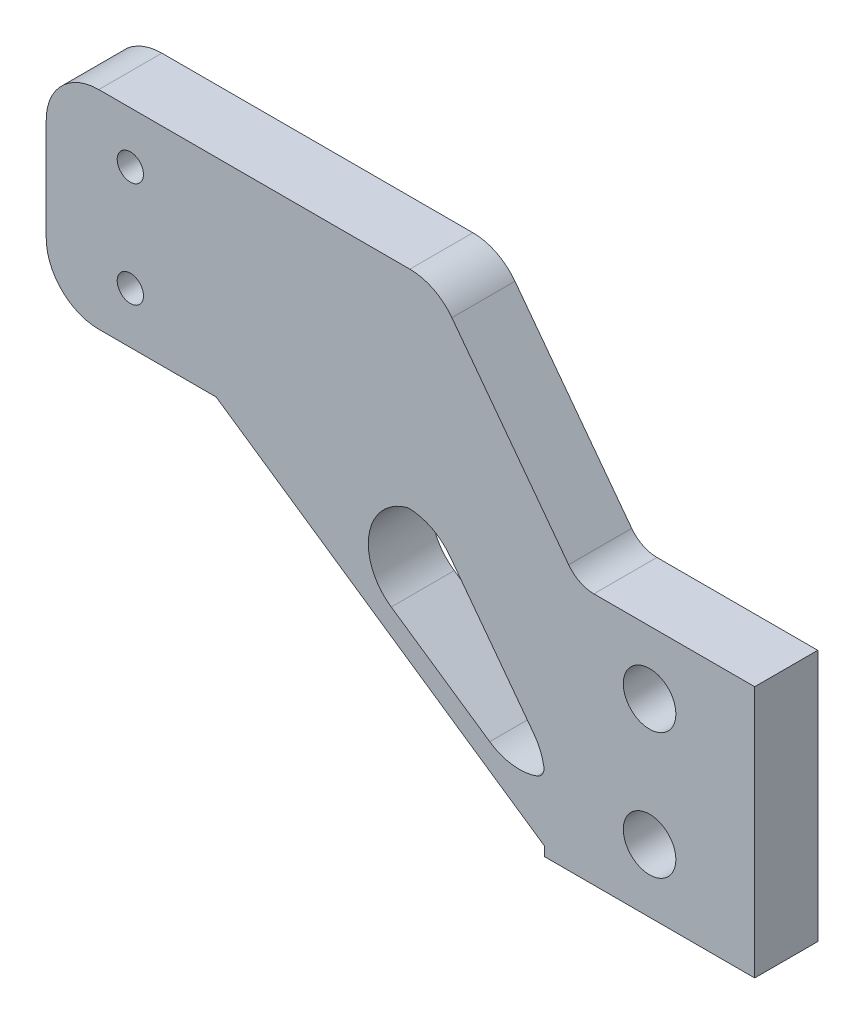
ISO-10303-21;
HEADER;
FILE_DESCRIPTION(('STEP AP214'),'2;1');
FILE_NAME('part.step','',(''),(''),'','','');
FILE_SCHEMA(('AUTOMOTIVE_DESIGN { 1 0 10303 214 1 1 1 1 }'));
ENDSEC;
DATA;
#1=APPLICATION_CONTEXT('core data for automotive mechanical design processes');
#2=APPLICATION_PROTOCOL_DEFINITION('international standard','automotive_design',2000,#1);
#3=PRODUCT_CONTEXT('',#1,'mechanical');
#4=PRODUCT('Part','Part','',(#3));
#5=PRODUCT_RELATED_PRODUCT_CATEGORY('part','',(#4));
#6=PRODUCT_DEFINITION_FORMATION('','',#4);
#7=PRODUCT_DEFINITION_CONTEXT('part definition',#1,'design');
#8=PRODUCT_DEFINITION('design','',#6,#7);
#9=PRODUCT_DEFINITION_SHAPE('','',#8);
#10=(LENGTH_UNIT() NAMED_UNIT(*) SI_UNIT(.MILLI.,.METRE.));
#11=(NAMED_UNIT(*) PLANE_ANGLE_UNIT() SI_UNIT($,.RADIAN.));
#12=(NAMED_UNIT(*) SI_UNIT($,.STERADIAN.) SOLID_ANGLE_UNIT());
#13=UNCERTAINTY_MEASURE_WITH_UNIT(LENGTH_MEASURE(1.E-05),#10,'distance_accuracy_value','');
#14=(GEOMETRIC_REPRESENTATION_CONTEXT(3) GLOBAL_UNCERTAINTY_ASSIGNED_CONTEXT((#13)) GLOBAL_UNIT_ASSIGNED_CONTEXT((#10,
#11,#12)) REPRESENTATION_CONTEXT('',''));
#15=CARTESIAN_POINT('',(0.,0.,0.));
#16=DIRECTION('',(0.,0.,1.));
#17=DIRECTION('',(1.,0.,0.));
#18=AXIS2_PLACEMENT_3D('',#15,#16,#17);
#19=CARTESIAN_POINT('',(-32.0936332487191,-14.75,6.));
#20=DIRECTION('',(0.,0.,-1.));
#21=DIRECTION('',(-1.,0.,0.));
#22=AXIS2_PLACEMENT_3D('',#19,#20,#21);
#23=PLANE('',#22);
#24=CARTESIAN_POINT('',(-29.0936332487191,-14.875,6.));
#25=DIRECTION('',(0.,0.,1.));
#26=DIRECTION('',(1.,0.,0.));
#27=AXIS2_PLACEMENT_3D('',#24,#25,#26);
#28=CIRCLE('',#27,1.25);
#29=CARTESIAN_POINT('',(-27.8436332487191,-14.875,6.));
#30=VERTEX_POINT('',#29);
#31=EDGE_CURVE('E208',#30,#30,#28,.T.);
#32=ORIENTED_EDGE('',*,*,#31,.F.);
#33=EDGE_LOOP('',(#32));
#34=FACE_BOUND('',#33,.T.);
#35=CARTESIAN_POINT('',(-29.0936332487191,-4.875,6.));
#36=DIRECTION('',(0.,0.,1.));
#37=DIRECTION('',(1.,0.,0.));
#38=AXIS2_PLACEMENT_3D('',#35,#36,#37);
#39=CIRCLE('',#38,1.25);
#40=CARTESIAN_POINT('',(-27.8436332487191,-4.875,6.));
#41=VERTEX_POINT('',#40);
#42=EDGE_CURVE('E214',#41,#41,#39,.T.);
#43=ORIENTED_EDGE('',*,*,#42,.F.);
#44=EDGE_LOOP('',(#43));
#45=FACE_BOUND('',#44,.T.);
#46=CARTESIAN_POINT('',(20.3063667512809,-24.,6.));
#47=DIRECTION('',(0.,0.,1.));
#48=DIRECTION('',(1.,0.,0.));
#49=AXIS2_PLACEMENT_3D('',#46,#47,#48);
#50=CIRCLE('',#49,2.5);
#51=CARTESIAN_POINT('',(22.8063667512809,-24.,6.));
#52=VERTEX_POINT('',#51);
#53=EDGE_CURVE('E220',#52,#52,#50,.T.);
#54=ORIENTED_EDGE('',*,*,#53,.F.);
#55=EDGE_LOOP('',(#54));
#56=FACE_BOUND('',#55,.T.);
#57=CARTESIAN_POINT('',(20.3063667512809,-36.,6.));
#58=DIRECTION('',(0.,0.,1.));
#59=DIRECTION('',(1.,0.,0.));
#60=AXIS2_PLACEMENT_3D('',#57,#58,#59);
#61=CIRCLE('',#60,2.5);
#62=CARTESIAN_POINT('',(22.8063667512809,-36.,6.));
#63=VERTEX_POINT('',#62);
#64=EDGE_CURVE('E226',#63,#63,#61,.T.);
#65=ORIENTED_EDGE('',*,*,#64,.F.);
#66=EDGE_LOOP('',(#65));
#67=FACE_BOUND('',#66,.T.);
#68=DIRECTION('',(0.,1.,0.));
#69=VECTOR('',#68,1.);
#70=CARTESIAN_POINT('',(30.3063667512809,-18.,6.));
#71=LINE('',#70,#69);
#72=CARTESIAN_POINT('',(30.3063667512809,-42.,6.));
#73=VERTEX_POINT('',#72);
#74=CARTESIAN_POINT('',(30.3063667512809,-18.,6.));
#75=VERTEX_POINT('',#74);
#76=EDGE_CURVE('E232',#73,#75,#71,.T.);
#77=ORIENTED_EDGE('',*,*,#76,.T.);
#78=DIRECTION('',(-1.,0.,0.));
#79=VECTOR('',#78,1.);
#80=CARTESIAN_POINT('',(15.0054751822955,-18.,6.));
#81=LINE('',#80,#79);
#82=CARTESIAN_POINT('',(15.0054751822955,-18.,6.));
#83=VERTEX_POINT('',#82);
#84=EDGE_CURVE('E235',#75,#83,#81,.T.);
#85=ORIENTED_EDGE('',*,*,#84,.T.);
#86=CARTESIAN_POINT('',(15.0054751822955,-15.,6.));
#87=DIRECTION('',(0.,0.,-1.));
#88=DIRECTION('',(-1.,0.,0.));
#89=AXIS2_PLACEMENT_3D('',#86,#87,#88);
#90=CIRCLE('',#89,3.);
#91=CARTESIAN_POINT('',(12.6058506112339,-16.8005004631928,6.));
#92=VERTEX_POINT('',#91);
#93=EDGE_CURVE('E238',#83,#92,#90,.T.);
#94=ORIENTED_EDGE('',*,*,#93,.T.);
#95=DIRECTION('',(-0.600166821064255,0.799874857020538,0.));
#96=VECTOR('',#95,1.);
#97=CARTESIAN_POINT('',(1.5000259468821,-1.99916589467874,6.));
#98=LINE('',#97,#96);
#99=CARTESIAN_POINT('',(1.5000259468821,-1.99916589467874,6.));
#100=VERTEX_POINT('',#99);
#101=EDGE_CURVE('E240',#92,#100,#98,.T.);
#102=ORIENTED_EDGE('',*,*,#101,.T.);
#103=CARTESIAN_POINT('',(-2.4993483382206,-5.,6.));
#104=DIRECTION('',(0.,0.,1.));
#105=DIRECTION('',(1.,0.,0.));
#106=AXIS2_PLACEMENT_3D('',#103,#104,#105);
#107=CIRCLE('',#106,5.);
#108=CARTESIAN_POINT('',(-2.49934833822063,0.,6.));
#109=VERTEX_POINT('',#108);
#110=EDGE_CURVE('E242',#100,#109,#107,.T.);
#111=ORIENTED_EDGE('',*,*,#110,.T.);
#112=DIRECTION('',(-1.,0.,0.));
#113=VECTOR('',#112,1.);
#114=CARTESIAN_POINT('',(-32.0936332487191,0.,6.));
#115=LINE('',#114,#113);
#116=CARTESIAN_POINT('',(-32.0936332487191,0.,6.));
#117=VERTEX_POINT('',#116);
#118=EDGE_CURVE('E244',#109,#117,#115,.T.);
#119=ORIENTED_EDGE('',*,*,#118,.T.);
#120=CARTESIAN_POINT('',(-32.0936332487191,-5.,6.));
#121=DIRECTION('',(0.,0.,1.));
#122=DIRECTION('',(-1.,0.,0.));
#123=AXIS2_PLACEMENT_3D('',#120,#121,#122);
#124=CIRCLE('',#123,5.);
#125=CARTESIAN_POINT('',(-37.0936332487191,-5.,6.));
#126=VERTEX_POINT('',#125);
#127=EDGE_CURVE('E246',#117,#126,#124,.T.);
#128=ORIENTED_EDGE('',*,*,#127,.T.);
#129=DIRECTION('',(0.,-1.,0.));
#130=VECTOR('',#129,1.);
#131=CARTESIAN_POINT('',(-37.0936332487191,-14.75,6.));
#132=LINE('',#131,#130);
#133=CARTESIAN_POINT('',(-37.0936332487191,-14.75,6.));
#134=VERTEX_POINT('',#133);
#135=EDGE_CURVE('E248',#126,#134,#132,.T.);
#136=ORIENTED_EDGE('',*,*,#135,.T.);
#137=CARTESIAN_POINT('',(-32.0936332487191,-14.75,6.));
#138=DIRECTION('',(0.,0.,1.));
#139=DIRECTION('',(-1.,0.,0.));
#140=AXIS2_PLACEMENT_3D('',#137,#138,#139);
#141=CIRCLE('',#140,5.);
#142=CARTESIAN_POINT('',(-32.0936332487191,-19.75,6.));
#143=VERTEX_POINT('',#142);
#144=EDGE_CURVE('E250',#134,#143,#141,.T.);
#145=ORIENTED_EDGE('',*,*,#144,.T.);
#146=DIRECTION('',(1.,0.,0.));
#147=VECTOR('',#146,1.);
#148=CARTESIAN_POINT('',(-20.9300183428523,-19.75,6.));
#149=LINE('',#148,#147);
#150=CARTESIAN_POINT('',(-20.9300183428523,-19.75,6.));
#151=VERTEX_POINT('',#150);
#152=EDGE_CURVE('E252',#143,#151,#149,.T.);
#153=ORIENTED_EDGE('',*,*,#152,.T.);
#154=DIRECTION('',(0.825309220487954,-0.564681052079459,0.));
#155=VECTOR('',#154,1.);
#156=CARTESIAN_POINT('',(10.3063667512809,-41.1221043703906,6.));
#157=LINE('',#156,#155);
#158=CARTESIAN_POINT('',(10.3063667512809,-41.1221043703906,6.));
#159=VERTEX_POINT('',#158);
#160=EDGE_CURVE('E254',#151,#159,#157,.T.);
#161=ORIENTED_EDGE('',*,*,#160,.T.);
#162=DIRECTION('',(0.,-1.,0.));
#163=VECTOR('',#162,1.);
#164=CARTESIAN_POINT('',(10.3063667512809,-42.,6.));
#165=LINE('',#164,#163);
#166=CARTESIAN_POINT('',(10.3063667512809,-42.,6.));
#167=VERTEX_POINT('',#166);
#168=EDGE_CURVE('E256',#159,#167,#165,.T.);
#169=ORIENTED_EDGE('',*,*,#168,.T.);
#170=DIRECTION('',(1.,0.,0.));
#171=VECTOR('',#170,1.);
#172=CARTESIAN_POINT('',(30.3063667512809,-42.,6.));
#173=LINE('',#172,#171);
#174=EDGE_CURVE('E258',#167,#73,#173,.T.);
#175=ORIENTED_EDGE('',*,*,#174,.T.);
#176=EDGE_LOOP('',(#77,#85,#94,#102,#111,#119,#128,#136,#145,#153,#161,#169,#175));
#177=FACE_BOUND('',#176,.T.);
#178=CARTESIAN_POINT('',(5.30636675128094,-35.3975404851727,6.));
#179=DIRECTION('',(0.,0.,1.));
#180=DIRECTION('',(1.,0.,0.));
#181=AXIS2_PLACEMENT_3D('',#178,#179,#180);
#182=CIRCLE('',#181,5.);
#183=CARTESIAN_POINT('',(10.2452682606298,-34.6182768064658,6.));
#184=VERTEX_POINT('',#183);
#185=CARTESIAN_POINT('',(9.30574103638362,-32.3967063798514,6.));
#186=VERTEX_POINT('',#185);
#187=EDGE_CURVE('E168',#184,#186,#182,.T.);
#188=ORIENTED_EDGE('',*,*,#187,.F.);
#189=CARTESIAN_POINT('',(9.25748795876001,-34.7741295422072,6.));
#190=DIRECTION('',(0.,0.,-1.));
#191=DIRECTION('',(-1.,0.,0.));
#192=AXIS2_PLACEMENT_3D('',#189,#190,#191);
#193=CIRCLE('',#192,1.);
#194=CARTESIAN_POINT('',(9.59265482048094,-35.7162883264916,6.));
#195=VERTEX_POINT('',#194);
#196=EDGE_CURVE('E11',#184,#195,#193,.T.);
#197=ORIENTED_EDGE('',*,*,#196,.T.);
#198=CARTESIAN_POINT('',(7.91682051187625,-31.0054944050699,6.));
#199=DIRECTION('',(0.,0.,-1.));
#200=DIRECTION('',(-1.,0.,0.));
#201=AXIS2_PLACEMENT_3D('',#198,#199,#200);
#202=CIRCLE('',#201,5.);
#203=CARTESIAN_POINT('',(5.09341525147896,-35.1320405075096,6.));
#204=VERTEX_POINT('',#203);
#205=EDGE_CURVE('E331',#195,#204,#202,.T.);
#206=ORIENTED_EDGE('',*,*,#205,.T.);
#207=DIRECTION('',(0.825309220487954,-0.564681052079459,0.));
#208=VECTOR('',#207,1.);
#209=CARTESIAN_POINT('',(-17.3881959412772,-19.75,6.));
#210=LINE('',#209,#208);
#211=CARTESIAN_POINT('',(-4.2744886585311,-28.7224697619457,6.));
#212=VERTEX_POINT('',#211);
#213=EDGE_CURVE('E191',#212,#204,#210,.T.);
#214=ORIENTED_EDGE('',*,*,#213,.F.);
#215=CARTESIAN_POINT('',(-1.4510833981338,-24.5959236595059,6.));
#216=DIRECTION('',(0.,0.,-1.));
#217=DIRECTION('',(-1.,0.,0.));
#218=AXIS2_PLACEMENT_3D('',#215,#216,#217);
#219=CIRCLE('',#218,5.);
#220=CARTESIAN_POINT('',(-2.6827586338354,-19.75,6.));
#221=VERTEX_POINT('',#220);
#222=EDGE_CURVE('E335',#212,#221,#219,.T.);
#223=ORIENTED_EDGE('',*,*,#222,.T.);
#224=CARTESIAN_POINT('',(-2.68275863383537,-24.75,6.));
#225=DIRECTION('',(0.,0.,1.));
#226=DIRECTION('',(1.,0.,0.));
#227=AXIS2_PLACEMENT_3D('',#224,#225,#226);
#228=CIRCLE('',#227,5.);
#229=CARTESIAN_POINT('',(1.31661565126733,-21.7491658946787,6.));
#230=VERTEX_POINT('',#229);
#231=EDGE_CURVE('E189',#230,#221,#228,.T.);
#232=ORIENTED_EDGE('',*,*,#231,.F.);
#233=DIRECTION('',(-0.600166821064255,0.799874857020538,0.));
#234=VECTOR('',#233,1.);
#235=CARTESIAN_POINT('',(9.30574103638362,-32.3967063798514,6.));
#236=LINE('',#235,#234);
#237=EDGE_CURVE('E175',#186,#230,#236,.T.);
#238=ORIENTED_EDGE('',*,*,#237,.F.);
#239=EDGE_LOOP('',(#188,#197,#206,#214,#223,#232,#238));
#240=FACE_BOUND('',#239,.T.);
#241=ADVANCED_FACE('F35',(#34,#45,#56,#67,#177,#240),#23,.F.);
#242=CARTESIAN_POINT('',(-32.0936332487191,-14.75,0.));
#243=DIRECTION('',(0.,0.,-1.));
#244=DIRECTION('',(-1.,0.,0.));
#245=AXIS2_PLACEMENT_3D('',#242,#243,#244);
#246=PLANE('',#245);
#247=CARTESIAN_POINT('',(-29.0936332487191,-4.875,0.));
#248=DIRECTION('',(0.,0.,1.));
#249=DIRECTION('',(1.,0.,0.));
#250=AXIS2_PLACEMENT_3D('',#247,#248,#249);
#251=CIRCLE('',#250,1.25);
#252=CARTESIAN_POINT('',(-27.8436332487191,-4.875,0.));
#253=VERTEX_POINT('',#252);
#254=EDGE_CURVE('E211',#253,#253,#251,.T.);
#255=ORIENTED_EDGE('',*,*,#254,.T.);
#256=EDGE_LOOP('',(#255));
#257=FACE_BOUND('',#256,.T.);
#258=CARTESIAN_POINT('',(20.3063667512809,-36.,0.));
#259=DIRECTION('',(0.,0.,1.));
#260=DIRECTION('',(1.,0.,0.));
#261=AXIS2_PLACEMENT_3D('',#258,#259,#260);
#262=CIRCLE('',#261,2.5);
#263=CARTESIAN_POINT('',(22.8063667512809,-36.,0.));
#264=VERTEX_POINT('',#263);
#265=EDGE_CURVE('E223',#264,#264,#262,.T.);
#266=ORIENTED_EDGE('',*,*,#265,.T.);
#267=EDGE_LOOP('',(#266));
#268=FACE_BOUND('',#267,.T.);
#269=DIRECTION('',(-1.,0.,0.));
#270=VECTOR('',#269,1.);
#271=CARTESIAN_POINT('',(15.0054751822955,-18.,0.));
#272=LINE('',#271,#270);
#273=CARTESIAN_POINT('',(30.3063667512809,-18.,0.));
#274=VERTEX_POINT('',#273);
#275=CARTESIAN_POINT('',(15.0054751822955,-18.,0.));
#276=VERTEX_POINT('',#275);
#277=EDGE_CURVE('E229',#274,#276,#272,.T.);
#278=ORIENTED_EDGE('',*,*,#277,.F.);
#279=DIRECTION('',(0.,1.,0.));
#280=VECTOR('',#279,1.);
#281=CARTESIAN_POINT('',(30.3063667512809,-32.6148542997745,0.));
#282=LINE('',#281,#280);
#283=CARTESIAN_POINT('',(30.3063667512809,-42.,0.));
#284=VERTEX_POINT('',#283);
#285=EDGE_CURVE('E236',#284,#274,#282,.T.);
#286=ORIENTED_EDGE('',*,*,#285,.F.);
#287=DIRECTION('',(1.,0.,0.));
#288=VECTOR('',#287,1.);
#289=CARTESIAN_POINT('',(30.3063667512809,-42.,0.));
#290=LINE('',#289,#288);
#291=CARTESIAN_POINT('',(10.3063667512809,-42.,0.));
#292=VERTEX_POINT('',#291);
#293=EDGE_CURVE('E283',#292,#284,#290,.T.);
#294=ORIENTED_EDGE('',*,*,#293,.F.);
#295=DIRECTION('',(0.,-1.,0.));
#296=VECTOR('',#295,1.);
#297=CARTESIAN_POINT('',(10.3063667512809,-42.,0.));
#298=LINE('',#297,#296);
#299=CARTESIAN_POINT('',(10.3063667512809,-41.1221043703906,0.));
#300=VERTEX_POINT('',#299);
#301=EDGE_CURVE('E281',#300,#292,#298,.T.);
#302=ORIENTED_EDGE('',*,*,#301,.F.);
#303=DIRECTION('',(0.825309220487954,-0.564681052079459,0.));
#304=VECTOR('',#303,1.);
#305=CARTESIAN_POINT('',(10.3063667512809,-41.1221043703906,0.));
#306=LINE('',#305,#304);
#307=CARTESIAN_POINT('',(-20.9300183428523,-19.75,0.));
#308=VERTEX_POINT('',#307);
#309=EDGE_CURVE('E279',#308,#300,#306,.T.);
#310=ORIENTED_EDGE('',*,*,#309,.F.);
#311=DIRECTION('',(1.,0.,0.));
#312=VECTOR('',#311,1.);
#313=CARTESIAN_POINT('',(-20.9300183428523,-19.75,0.));
#314=LINE('',#313,#312);
#315=CARTESIAN_POINT('',(-32.0936332487191,-19.75,0.));
#316=VERTEX_POINT('',#315);
#317=EDGE_CURVE('E277',#316,#308,#314,.T.);
#318=ORIENTED_EDGE('',*,*,#317,.F.);
#319=CARTESIAN_POINT('',(-32.0936332487191,-14.75,0.));
#320=DIRECTION('',(0.,0.,1.));
#321=DIRECTION('',(-1.,0.,0.));
#322=AXIS2_PLACEMENT_3D('',#319,#320,#321);
#323=CIRCLE('',#322,5.);
#324=CARTESIAN_POINT('',(-37.0936332487191,-14.75,0.));
#325=VERTEX_POINT('',#324);
#326=EDGE_CURVE('E275',#325,#316,#323,.T.);
#327=ORIENTED_EDGE('',*,*,#326,.F.);
#328=DIRECTION('',(0.,-1.,0.));
#329=VECTOR('',#328,1.);
#330=CARTESIAN_POINT('',(-37.0936332487191,-14.75,0.));
#331=LINE('',#330,#329);
#332=CARTESIAN_POINT('',(-37.0936332487191,-5.,0.));
#333=VERTEX_POINT('',#332);
#334=EDGE_CURVE('E273',#333,#325,#331,.T.);
#335=ORIENTED_EDGE('',*,*,#334,.F.);
#336=CARTESIAN_POINT('',(-32.0936332487191,-5.,0.));
#337=DIRECTION('',(0.,0.,1.));
#338=DIRECTION('',(-1.,0.,0.));
#339=AXIS2_PLACEMENT_3D('',#336,#337,#338);
#340=CIRCLE('',#339,5.);
#341=CARTESIAN_POINT('',(-32.0936332487191,0.,0.));
#342=VERTEX_POINT('',#341);
#343=EDGE_CURVE('E271',#342,#333,#340,.T.);
#344=ORIENTED_EDGE('',*,*,#343,.F.);
#345=DIRECTION('',(-1.,0.,0.));
#346=VECTOR('',#345,1.);
#347=CARTESIAN_POINT('',(-32.0936332487191,0.,0.));
#348=LINE('',#347,#346);
#349=CARTESIAN_POINT('',(-2.49934833822063,0.,0.));
#350=VERTEX_POINT('',#349);
#351=EDGE_CURVE('E269',#350,#342,#348,.T.);
#352=ORIENTED_EDGE('',*,*,#351,.F.);
#353=CARTESIAN_POINT('',(-2.4993483382206,-5.,0.));
#354=DIRECTION('',(0.,0.,1.));
#355=DIRECTION('',(1.,0.,0.));
#356=AXIS2_PLACEMENT_3D('',#353,#354,#355);
#357=CIRCLE('',#356,5.);
#358=CARTESIAN_POINT('',(1.5000259468821,-1.99916589467874,0.));
#359=VERTEX_POINT('',#358);
#360=EDGE_CURVE('E267',#359,#350,#357,.T.);
#361=ORIENTED_EDGE('',*,*,#360,.F.);
#362=DIRECTION('',(-0.600166821064255,0.799874857020538,0.));
#363=VECTOR('',#362,1.);
#364=CARTESIAN_POINT('',(1.5000259468821,-1.99916589467874,0.));
#365=LINE('',#364,#363);
#366=CARTESIAN_POINT('',(12.6058506112339,-16.8005004631928,0.));
#367=VERTEX_POINT('',#366);
#368=EDGE_CURVE('E265',#367,#359,#365,.T.);
#369=ORIENTED_EDGE('',*,*,#368,.F.);
#370=CARTESIAN_POINT('',(15.0054751822955,-15.,0.));
#371=DIRECTION('',(0.,0.,-1.));
#372=DIRECTION('',(-1.,0.,0.));
#373=AXIS2_PLACEMENT_3D('',#370,#371,#372);
#374=CIRCLE('',#373,3.);
#375=EDGE_CURVE('E263',#276,#367,#374,.T.);
#376=ORIENTED_EDGE('',*,*,#375,.F.);
#377=EDGE_LOOP('',(#278,#286,#294,#302,#310,#318,#327,#335,#344,#352,#361,#369,#376));
#378=FACE_BOUND('',#377,.T.);
#379=CARTESIAN_POINT('',(20.3063667512809,-24.,0.));
#380=DIRECTION('',(0.,0.,1.));
#381=DIRECTION('',(1.,0.,0.));
#382=AXIS2_PLACEMENT_3D('',#379,#380,#381);
#383=CIRCLE('',#382,2.5);
#384=CARTESIAN_POINT('',(22.8063667512809,-24.,0.));
#385=VERTEX_POINT('',#384);
#386=EDGE_CURVE('E217',#385,#385,#383,.T.);
#387=ORIENTED_EDGE('',*,*,#386,.T.);
#388=EDGE_LOOP('',(#387));
#389=FACE_BOUND('',#388,.T.);
#390=CARTESIAN_POINT('',(-29.0936332487191,-14.875,0.));
#391=DIRECTION('',(0.,0.,1.));
#392=DIRECTION('',(1.,0.,0.));
#393=AXIS2_PLACEMENT_3D('',#390,#391,#392);
#394=CIRCLE('',#393,1.25);
#395=CARTESIAN_POINT('',(-27.8436332487191,-14.875,0.));
#396=VERTEX_POINT('',#395);
#397=EDGE_CURVE('E184',#396,#396,#394,.T.);
#398=ORIENTED_EDGE('',*,*,#397,.T.);
#399=EDGE_LOOP('',(#398));
#400=FACE_BOUND('',#399,.T.);
#401=DIRECTION('',(0.825309220487954,-0.564681052079459,0.));
#402=VECTOR('',#401,1.);
#403=CARTESIAN_POINT('',(-17.3881959412772,-19.75,0.));
#404=LINE('',#403,#402);
#405=CARTESIAN_POINT('',(-4.2744886585311,-28.7224697619457,0.));
#406=VERTEX_POINT('',#405);
#407=CARTESIAN_POINT('',(5.09341525147896,-35.1320405075096,0.));
#408=VERTEX_POINT('',#407);
#409=EDGE_CURVE('E176',#406,#408,#404,.T.);
#410=ORIENTED_EDGE('',*,*,#409,.T.);
#411=CARTESIAN_POINT('',(7.91682051187625,-31.0054944050699,0.));
#412=DIRECTION('',(0.,0.,-1.));
#413=DIRECTION('',(-1.,0.,0.));
#414=AXIS2_PLACEMENT_3D('',#411,#412,#413);
#415=CIRCLE('',#414,5.);
#416=CARTESIAN_POINT('',(9.59265482048094,-35.7162883264916,0.));
#417=VERTEX_POINT('',#416);
#418=EDGE_CURVE('E329',#408,#417,#415,.F.);
#419=ORIENTED_EDGE('',*,*,#418,.T.);
#420=CARTESIAN_POINT('',(9.25748795876001,-34.7741295422072,0.));
#421=DIRECTION('',(0.,0.,-1.));
#422=DIRECTION('',(-1.,0.,0.));
#423=AXIS2_PLACEMENT_3D('',#420,#421,#422);
#424=CIRCLE('',#423,1.);
#425=CARTESIAN_POINT('',(10.2452682606298,-34.6182768064658,0.));
#426=VERTEX_POINT('',#425);
#427=EDGE_CURVE('E43',#417,#426,#424,.F.);
#428=ORIENTED_EDGE('',*,*,#427,.T.);
#429=CARTESIAN_POINT('',(5.30636675128094,-35.3975404851727,0.));
#430=DIRECTION('',(0.,0.,1.));
#431=DIRECTION('',(1.,0.,0.));
#432=AXIS2_PLACEMENT_3D('',#429,#430,#431);
#433=CIRCLE('',#432,5.);
#434=CARTESIAN_POINT('',(9.30574103638362,-32.3967063798514,0.));
#435=VERTEX_POINT('',#434);
#436=EDGE_CURVE('E197',#426,#435,#433,.T.);
#437=ORIENTED_EDGE('',*,*,#436,.T.);
#438=DIRECTION('',(-0.600166821064255,0.799874857020538,0.));
#439=VECTOR('',#438,1.);
#440=CARTESIAN_POINT('',(9.30574103638362,-32.3967063798514,0.));
#441=LINE('',#440,#439);
#442=CARTESIAN_POINT('',(1.31661565126733,-21.7491658946787,0.));
#443=VERTEX_POINT('',#442);
#444=EDGE_CURVE('E183',#435,#443,#441,.T.);
#445=ORIENTED_EDGE('',*,*,#444,.T.);
#446=CARTESIAN_POINT('',(-2.68275863383537,-24.75,0.));
#447=DIRECTION('',(0.,0.,1.));
#448=DIRECTION('',(1.,0.,0.));
#449=AXIS2_PLACEMENT_3D('',#446,#447,#448);
#450=CIRCLE('',#449,5.);
#451=CARTESIAN_POINT('',(-2.6827586338354,-19.75,0.));
#452=VERTEX_POINT('',#451);
#453=EDGE_CURVE('E200',#443,#452,#450,.T.);
#454=ORIENTED_EDGE('',*,*,#453,.T.);
#455=CARTESIAN_POINT('',(-1.4510833981338,-24.5959236595059,0.));
#456=DIRECTION('',(0.,0.,-1.));
#457=DIRECTION('',(-1.,0.,0.));
#458=AXIS2_PLACEMENT_3D('',#455,#456,#457);
#459=CIRCLE('',#458,5.);
#460=EDGE_CURVE('E333',#452,#406,#459,.F.);
#461=ORIENTED_EDGE('',*,*,#460,.T.);
#462=EDGE_LOOP('',(#410,#419,#428,#437,#445,#454,#461));
#463=FACE_BOUND('',#462,.T.);
#464=ADVANCED_FACE('F346',(#257,#268,#378,#389,#400,#463),#246,.T.);
#465=CARTESIAN_POINT('',(15.0054751822955,-18.,6.));
#466=DIRECTION('',(0.,-1.,0.));
#467=DIRECTION('',(0.,0.,-1.));
#468=AXIS2_PLACEMENT_3D('',#465,#466,#467);
#469=PLANE('',#468);
#470=ORIENTED_EDGE('',*,*,#277,.T.);
#471=DIRECTION('',(0.,0.,-1.));
#472=VECTOR('',#471,1.);
#473=CARTESIAN_POINT('',(15.0054751822955,-18.,6.));
#474=LINE('',#473,#472);
#475=EDGE_CURVE('E318',#83,#276,#474,.T.);
#476=ORIENTED_EDGE('',*,*,#475,.F.);
#477=ORIENTED_EDGE('',*,*,#84,.F.);
#478=DIRECTION('',(0.,0.,-1.));
#479=VECTOR('',#478,1.);
#480=CARTESIAN_POINT('',(30.3063667512809,-18.,6.));
#481=LINE('',#480,#479);
#482=EDGE_CURVE('E321',#75,#274,#481,.T.);
#483=ORIENTED_EDGE('',*,*,#482,.T.);
#484=EDGE_LOOP('',(#470,#476,#477,#483));
#485=FACE_BOUND('',#484,.T.);
#486=ADVANCED_FACE('F369',(#485),#469,.F.);
#487=CARTESIAN_POINT('',(15.0054751822955,-15.,6.));
#488=DIRECTION('',(0.,0.,-1.));
#489=DIRECTION('',(-1.,0.,0.));
#490=AXIS2_PLACEMENT_3D('',#487,#488,#489);
#491=CYLINDRICAL_SURFACE('',#490,3.);
#492=ORIENTED_EDGE('',*,*,#375,.T.);
#493=DIRECTION('',(0.,0.,-1.));
#494=VECTOR('',#493,1.);
#495=CARTESIAN_POINT('',(12.6058506112339,-16.8005004631928,6.));
#496=LINE('',#495,#494);
#497=EDGE_CURVE('E315',#92,#367,#496,.T.);
#498=ORIENTED_EDGE('',*,*,#497,.F.);
#499=ORIENTED_EDGE('',*,*,#93,.F.);
#500=ORIENTED_EDGE('',*,*,#475,.T.);
#501=EDGE_LOOP('',(#492,#498,#499,#500));
#502=FACE_BOUND('',#501,.T.);
#503=ADVANCED_FACE('F421',(#502),#491,.F.);
#504=CARTESIAN_POINT('',(1.5000259468821,-1.99916589467874,6.));
#505=DIRECTION('',(-0.799874857020538,-0.600166821064255,0.));
#506=DIRECTION('',(0.600166821064255,-0.799874857020538,0.));
#507=AXIS2_PLACEMENT_3D('',#504,#505,#506);
#508=PLANE('',#507);
#509=ORIENTED_EDGE('',*,*,#368,.T.);
#510=DIRECTION('',(0.,0.,-1.));
#511=VECTOR('',#510,1.);
#512=CARTESIAN_POINT('',(1.5000259468821,-1.99916589467874,6.));
#513=LINE('',#512,#511);
#514=EDGE_CURVE('E312',#100,#359,#513,.T.);
#515=ORIENTED_EDGE('',*,*,#514,.F.);
#516=ORIENTED_EDGE('',*,*,#101,.F.);
#517=ORIENTED_EDGE('',*,*,#497,.T.);
#518=EDGE_LOOP('',(#509,#515,#516,#517));
#519=FACE_BOUND('',#518,.T.);
#520=ADVANCED_FACE('F417',(#519),#508,.F.);
#521=CARTESIAN_POINT('',(-2.4993483382206,-5.,6.));
#522=DIRECTION('',(0.,0.,-1.));
#523=DIRECTION('',(-1.,0.,0.));
#524=AXIS2_PLACEMENT_3D('',#521,#522,#523);
#525=CYLINDRICAL_SURFACE('',#524,5.);
#526=ORIENTED_EDGE('',*,*,#360,.T.);
#527=DIRECTION('',(0.,0.,-1.));
#528=VECTOR('',#527,1.);
#529=CARTESIAN_POINT('',(-2.49934833822063,0.,6.));
#530=LINE('',#529,#528);
#531=EDGE_CURVE('E309',#109,#350,#530,.T.);
#532=ORIENTED_EDGE('',*,*,#531,.F.);
#533=ORIENTED_EDGE('',*,*,#110,.F.);
#534=ORIENTED_EDGE('',*,*,#514,.T.);
#535=EDGE_LOOP('',(#526,#532,#533,#534));
#536=FACE_BOUND('',#535,.T.);
#537=ADVANCED_FACE('F413',(#536),#525,.T.);
#538=CARTESIAN_POINT('',(-32.0936332487191,0.,6.));
#539=DIRECTION('',(0.,-1.,0.));
#540=DIRECTION('',(0.,0.,-1.));
#541=AXIS2_PLACEMENT_3D('',#538,#539,#540);
#542=PLANE('',#541);
#543=ORIENTED_EDGE('',*,*,#351,.T.);
#544=DIRECTION('',(0.,0.,-1.));
#545=VECTOR('',#544,1.);
#546=CARTESIAN_POINT('',(-32.0936332487191,0.,6.));
#547=LINE('',#546,#545);
#548=EDGE_CURVE('E306',#117,#342,#547,.T.);
#549=ORIENTED_EDGE('',*,*,#548,.F.);
#550=ORIENTED_EDGE('',*,*,#118,.F.);
#551=ORIENTED_EDGE('',*,*,#531,.T.);
#552=EDGE_LOOP('',(#543,#549,#550,#551));
#553=FACE_BOUND('',#552,.T.);
#554=ADVANCED_FACE('F409',(#553),#542,.F.);
#555=CARTESIAN_POINT('',(-32.0936332487191,-5.,6.));
#556=DIRECTION('',(0.,0.,-1.));
#557=DIRECTION('',(-1.,0.,0.));
#558=AXIS2_PLACEMENT_3D('',#555,#556,#557);
#559=CYLINDRICAL_SURFACE('',#558,5.);
#560=ORIENTED_EDGE('',*,*,#343,.T.);
#561=DIRECTION('',(0.,0.,-1.));
#562=VECTOR('',#561,1.);
#563=CARTESIAN_POINT('',(-37.0936332487191,-5.,6.));
#564=LINE('',#563,#562);
#565=EDGE_CURVE('E303',#126,#333,#564,.T.);
#566=ORIENTED_EDGE('',*,*,#565,.F.);
#567=ORIENTED_EDGE('',*,*,#127,.F.);
#568=ORIENTED_EDGE('',*,*,#548,.T.);
#569=EDGE_LOOP('',(#560,#566,#567,#568));
#570=FACE_BOUND('',#569,.T.);
#571=ADVANCED_FACE('F405',(#570),#559,.T.);
#572=CARTESIAN_POINT('',(-37.0936332487191,-14.75,6.));
#573=DIRECTION('',(1.,0.,0.));
#574=DIRECTION('',(0.,0.,-1.));
#575=AXIS2_PLACEMENT_3D('',#572,#573,#574);
#576=PLANE('',#575);
#577=ORIENTED_EDGE('',*,*,#334,.T.);
#578=DIRECTION('',(0.,0.,-1.));
#579=VECTOR('',#578,1.);
#580=CARTESIAN_POINT('',(-37.0936332487191,-14.75,6.));
#581=LINE('',#580,#579);
#582=EDGE_CURVE('E300',#134,#325,#581,.T.);
#583=ORIENTED_EDGE('',*,*,#582,.F.);
#584=ORIENTED_EDGE('',*,*,#135,.F.);
#585=ORIENTED_EDGE('',*,*,#565,.T.);
#586=EDGE_LOOP('',(#577,#583,#584,#585));
#587=FACE_BOUND('',#586,.T.);
#588=ADVANCED_FACE('F401',(#587),#576,.F.);
#589=CARTESIAN_POINT('',(-32.0936332487191,-14.75,6.));
#590=DIRECTION('',(0.,0.,-1.));
#591=DIRECTION('',(-1.,0.,0.));
#592=AXIS2_PLACEMENT_3D('',#589,#590,#591);
#593=CYLINDRICAL_SURFACE('',#592,5.);
#594=ORIENTED_EDGE('',*,*,#326,.T.);
#595=DIRECTION('',(0.,0.,-1.));
#596=VECTOR('',#595,1.);
#597=CARTESIAN_POINT('',(-32.0936332487191,-19.75,6.));
#598=LINE('',#597,#596);
#599=EDGE_CURVE('E297',#143,#316,#598,.T.);
#600=ORIENTED_EDGE('',*,*,#599,.F.);
#601=ORIENTED_EDGE('',*,*,#144,.F.);
#602=ORIENTED_EDGE('',*,*,#582,.T.);
#603=EDGE_LOOP('',(#594,#600,#601,#602));
#604=FACE_BOUND('',#603,.T.);
#605=ADVANCED_FACE('F397',(#604),#593,.T.);
#606=CARTESIAN_POINT('',(-20.9300183428523,-19.75,6.));
#607=DIRECTION('',(0.,1.,0.));
#608=DIRECTION('',(-1.,0.,0.));
#609=AXIS2_PLACEMENT_3D('',#606,#607,#608);
#610=PLANE('',#609);
#611=ORIENTED_EDGE('',*,*,#317,.T.);
#612=DIRECTION('',(0.,0.,-1.));
#613=VECTOR('',#612,1.);
#614=CARTESIAN_POINT('',(-20.9300183428523,-19.75,6.));
#615=LINE('',#614,#613);
#616=EDGE_CURVE('E294',#151,#308,#615,.T.);
#617=ORIENTED_EDGE('',*,*,#616,.F.);
#618=ORIENTED_EDGE('',*,*,#152,.F.);
#619=ORIENTED_EDGE('',*,*,#599,.T.);
#620=EDGE_LOOP('',(#611,#617,#618,#619));
#621=FACE_BOUND('',#620,.T.);
#622=ADVANCED_FACE('F393',(#621),#610,.F.);
#623=CARTESIAN_POINT('',(10.3063667512809,-41.1221043703906,6.));
#624=DIRECTION('',(0.564681052079459,0.825309220487954,0.));
#625=DIRECTION('',(-0.825309220487954,0.564681052079459,0.));
#626=AXIS2_PLACEMENT_3D('',#623,#624,#625);
#627=PLANE('',#626);
#628=ORIENTED_EDGE('',*,*,#309,.T.);
#629=DIRECTION('',(0.,0.,-1.));
#630=VECTOR('',#629,1.);
#631=CARTESIAN_POINT('',(10.3063667512809,-41.1221043703906,6.));
#632=LINE('',#631,#630);
#633=EDGE_CURVE('E291',#159,#300,#632,.T.);
#634=ORIENTED_EDGE('',*,*,#633,.F.);
#635=ORIENTED_EDGE('',*,*,#160,.F.);
#636=ORIENTED_EDGE('',*,*,#616,.T.);
#637=EDGE_LOOP('',(#628,#634,#635,#636));
#638=FACE_BOUND('',#637,.T.);
#639=ADVANCED_FACE('F389',(#638),#627,.F.);
#640=CARTESIAN_POINT('',(10.3063667512809,-42.,6.));
#641=DIRECTION('',(1.,0.,0.));
#642=DIRECTION('',(0.,0.,-1.));
#643=AXIS2_PLACEMENT_3D('',#640,#641,#642);
#644=PLANE('',#643);
#645=ORIENTED_EDGE('',*,*,#301,.T.);
#646=DIRECTION('',(0.,0.,-1.));
#647=VECTOR('',#646,1.);
#648=CARTESIAN_POINT('',(10.3063667512809,-42.,6.));
#649=LINE('',#648,#647);
#650=EDGE_CURVE('E288',#167,#292,#649,.T.);
#651=ORIENTED_EDGE('',*,*,#650,.F.);
#652=ORIENTED_EDGE('',*,*,#168,.F.);
#653=ORIENTED_EDGE('',*,*,#633,.T.);
#654=EDGE_LOOP('',(#645,#651,#652,#653));
#655=FACE_BOUND('',#654,.T.);
#656=ADVANCED_FACE('F385',(#655),#644,.F.);
#657=CARTESIAN_POINT('',(30.3063667512809,-42.,6.));
#658=DIRECTION('',(0.,1.,0.));
#659=DIRECTION('',(0.,0.,1.));
#660=AXIS2_PLACEMENT_3D('',#657,#658,#659);
#661=PLANE('',#660);
#662=ORIENTED_EDGE('',*,*,#293,.T.);
#663=DIRECTION('',(0.,0.,-1.));
#664=VECTOR('',#663,1.);
#665=CARTESIAN_POINT('',(30.3063667512809,-42.,6.));
#666=LINE('',#665,#664);
#667=EDGE_CURVE('E261',#73,#284,#666,.T.);
#668=ORIENTED_EDGE('',*,*,#667,.F.);
#669=ORIENTED_EDGE('',*,*,#174,.F.);
#670=ORIENTED_EDGE('',*,*,#650,.T.);
#671=EDGE_LOOP('',(#662,#668,#669,#670));
#672=FACE_BOUND('',#671,.T.);
#673=ADVANCED_FACE('F381',(#672),#661,.F.);
#674=CARTESIAN_POINT('',(30.3063667512809,-32.6148542997745,6.));
#675=DIRECTION('',(-1.,0.,0.));
#676=DIRECTION('',(0.,0.,1.));
#677=AXIS2_PLACEMENT_3D('',#674,#675,#676);
#678=PLANE('',#677);
#679=ORIENTED_EDGE('',*,*,#285,.T.);
#680=ORIENTED_EDGE('',*,*,#482,.F.);
#681=ORIENTED_EDGE('',*,*,#76,.F.);
#682=ORIENTED_EDGE('',*,*,#667,.T.);
#683=EDGE_LOOP('',(#679,#680,#681,#682));
#684=FACE_BOUND('',#683,.T.);
#685=ADVANCED_FACE('F378',(#684),#678,.F.);
#686=CARTESIAN_POINT('',(20.3063667512809,-36.,6.));
#687=DIRECTION('',(0.,0.,-1.));
#688=DIRECTION('',(-1.,0.,0.));
#689=AXIS2_PLACEMENT_3D('',#686,#687,#688);
#690=CYLINDRICAL_SURFACE('',#689,2.5);
#691=ORIENTED_EDGE('',*,*,#64,.T.);
#692=EDGE_LOOP('',(#691));
#693=FACE_BOUND('',#692,.T.);
#694=ORIENTED_EDGE('',*,*,#265,.F.);
#695=EDGE_LOOP('',(#694));
#696=FACE_BOUND('',#695,.T.);
#697=ADVANCED_FACE('F375',(#693,#696),#690,.F.);
#698=CARTESIAN_POINT('',(20.3063667512809,-24.,6.));
#699=DIRECTION('',(0.,0.,-1.));
#700=DIRECTION('',(-1.,0.,0.));
#701=AXIS2_PLACEMENT_3D('',#698,#699,#700);
#702=CYLINDRICAL_SURFACE('',#701,2.5);
#703=ORIENTED_EDGE('',*,*,#53,.T.);
#704=EDGE_LOOP('',(#703));
#705=FACE_BOUND('',#704,.T.);
#706=ORIENTED_EDGE('',*,*,#386,.F.);
#707=EDGE_LOOP('',(#706));
#708=FACE_BOUND('',#707,.T.);
#709=ADVANCED_FACE('F449',(#705,#708),#702,.F.);
#710=CARTESIAN_POINT('',(-29.0936332487191,-4.875,6.));
#711=DIRECTION('',(0.,0.,-1.));
#712=DIRECTION('',(-1.,0.,0.));
#713=AXIS2_PLACEMENT_3D('',#710,#711,#712);
#714=CYLINDRICAL_SURFACE('',#713,1.25);
#715=ORIENTED_EDGE('',*,*,#42,.T.);
#716=EDGE_LOOP('',(#715));
#717=FACE_BOUND('',#716,.T.);
#718=ORIENTED_EDGE('',*,*,#254,.F.);
#719=EDGE_LOOP('',(#718));
#720=FACE_BOUND('',#719,.T.);
#721=ADVANCED_FACE('F446',(#717,#720),#714,.F.);
#722=CARTESIAN_POINT('',(-29.0936332487191,-14.875,6.));
#723=DIRECTION('',(0.,0.,-1.));
#724=DIRECTION('',(-1.,0.,0.));
#725=AXIS2_PLACEMENT_3D('',#722,#723,#724);
#726=CYLINDRICAL_SURFACE('',#725,1.25);
#727=ORIENTED_EDGE('',*,*,#31,.T.);
#728=EDGE_LOOP('',(#727));
#729=FACE_BOUND('',#728,.T.);
#730=ORIENTED_EDGE('',*,*,#397,.F.);
#731=EDGE_LOOP('',(#730));
#732=FACE_BOUND('',#731,.T.);
#733=ADVANCED_FACE('F443',(#729,#732),#726,.F.);
#734=CARTESIAN_POINT('',(5.30636675128094,-35.3975404851727,6.));
#735=DIRECTION('',(0.,0.,-1.));
#736=DIRECTION('',(-1.,0.,0.));
#737=AXIS2_PLACEMENT_3D('',#734,#735,#736);
#738=CYLINDRICAL_SURFACE('',#737,5.);
#739=ORIENTED_EDGE('',*,*,#436,.F.);
#740=DIRECTION('',(0.,0.,-1.));
#741=VECTOR('',#740,1.);
#742=CARTESIAN_POINT('',(10.2452682606298,-34.6182768064658,6.));
#743=LINE('',#742,#741);
#744=EDGE_CURVE('E50',#426,#184,#743,.F.);
#745=ORIENTED_EDGE('',*,*,#744,.T.);
#746=ORIENTED_EDGE('',*,*,#187,.T.);
#747=DIRECTION('',(0.,0.,-1.));
#748=VECTOR('',#747,1.);
#749=CARTESIAN_POINT('',(9.30574103638362,-32.3967063798514,6.));
#750=LINE('',#749,#748);
#751=EDGE_CURVE('E171',#186,#435,#750,.T.);
#752=ORIENTED_EDGE('',*,*,#751,.T.);
#753=EDGE_LOOP('',(#739,#745,#746,#752));
#754=FACE_BOUND('',#753,.T.);
#755=ADVANCED_FACE('F170',(#754),#738,.F.);
#756=CARTESIAN_POINT('',(9.30574103638362,-32.3967063798514,6.));
#757=DIRECTION('',(-0.799874857020538,-0.600166821064255,0.));
#758=DIRECTION('',(0.600166821064255,-0.799874857020538,0.));
#759=AXIS2_PLACEMENT_3D('',#756,#757,#758);
#760=PLANE('',#759);
#761=ORIENTED_EDGE('',*,*,#444,.F.);
#762=ORIENTED_EDGE('',*,*,#751,.F.);
#763=ORIENTED_EDGE('',*,*,#237,.T.);
#764=DIRECTION('',(0.,0.,-1.));
#765=VECTOR('',#764,1.);
#766=CARTESIAN_POINT('',(1.31661565126733,-21.7491658946787,6.));
#767=LINE('',#766,#765);
#768=EDGE_CURVE('E185',#230,#443,#767,.T.);
#769=ORIENTED_EDGE('',*,*,#768,.T.);
#770=EDGE_LOOP('',(#761,#762,#763,#769));
#771=FACE_BOUND('',#770,.T.);
#772=ADVANCED_FACE('F180',(#771),#760,.T.);
#773=CARTESIAN_POINT('',(-2.68275863383537,-24.75,6.));
#774=DIRECTION('',(0.,0.,-1.));
#775=DIRECTION('',(-1.,0.,0.));
#776=AXIS2_PLACEMENT_3D('',#773,#774,#775);
#777=CYLINDRICAL_SURFACE('',#776,5.);
#778=ORIENTED_EDGE('',*,*,#453,.F.);
#779=ORIENTED_EDGE('',*,*,#768,.F.);
#780=ORIENTED_EDGE('',*,*,#231,.T.);
#781=DIRECTION('',(0.,0.,-1.));
#782=VECTOR('',#781,1.);
#783=CARTESIAN_POINT('',(-2.6827586338354,-19.75,6.));
#784=LINE('',#783,#782);
#785=EDGE_CURVE('E196',#221,#452,#784,.T.);
#786=ORIENTED_EDGE('',*,*,#785,.T.);
#787=EDGE_LOOP('',(#778,#779,#780,#786));
#788=FACE_BOUND('',#787,.T.);
#789=ADVANCED_FACE('F358',(#788),#777,.F.);
#790=CARTESIAN_POINT('',(-17.3881959412772,-19.75,6.));
#791=DIRECTION('',(0.564681052079459,0.825309220487954,0.));
#792=DIRECTION('',(-0.825309220487955,0.56468105207946,0.));
#793=AXIS2_PLACEMENT_3D('',#790,#791,#792);
#794=PLANE('',#793);
#795=ORIENTED_EDGE('',*,*,#213,.T.);
#796=DIRECTION('',(0.,0.,1.));
#797=VECTOR('',#796,1.);
#798=CARTESIAN_POINT('',(5.09341525147896,-35.1320405075096,0.));
#799=LINE('',#798,#797);
#800=EDGE_CURVE('E326',#204,#408,#799,.F.);
#801=ORIENTED_EDGE('',*,*,#800,.T.);
#802=ORIENTED_EDGE('',*,*,#409,.F.);
#803=DIRECTION('',(0.,0.,1.));
#804=VECTOR('',#803,1.);
#805=CARTESIAN_POINT('',(-4.2744886585311,-28.7224697619457,6.));
#806=LINE('',#805,#804);
#807=EDGE_CURVE('E324',#406,#212,#806,.T.);
#808=ORIENTED_EDGE('',*,*,#807,.T.);
#809=EDGE_LOOP('',(#795,#801,#802,#808));
#810=FACE_BOUND('',#809,.T.);
#811=ADVANCED_FACE('F350',(#810),#794,.T.);
#812=CARTESIAN_POINT('',(7.91682051187625,-31.0054944050699,6.));
#813=DIRECTION('',(0.,0.,-1.));
#814=DIRECTION('',(-1.,0.,0.));
#815=AXIS2_PLACEMENT_3D('',#812,#813,#814);
#816=CYLINDRICAL_SURFACE('',#815,5.);
#817=ORIENTED_EDGE('',*,*,#205,.F.);
#818=DIRECTION('',(0.,0.,-1.));
#819=VECTOR('',#818,1.);
#820=CARTESIAN_POINT('',(9.59265482048095,-35.7162883264916,6.));
#821=LINE('',#820,#819);
#822=EDGE_CURVE('E337',#195,#417,#821,.T.);
#823=ORIENTED_EDGE('',*,*,#822,.T.);
#824=ORIENTED_EDGE('',*,*,#418,.F.);
#825=ORIENTED_EDGE('',*,*,#800,.F.);
#826=EDGE_LOOP('',(#817,#823,#824,#825));
#827=FACE_BOUND('',#826,.T.);
#828=ADVANCED_FACE('F343',(#827),#816,.F.);
#829=CARTESIAN_POINT('',(-1.4510833981338,-24.5959236595059,6.));
#830=DIRECTION('',(0.,0.,-1.));
#831=DIRECTION('',(-1.,0.,0.));
#832=AXIS2_PLACEMENT_3D('',#829,#830,#831);
#833=CYLINDRICAL_SURFACE('',#832,5.);
#834=ORIENTED_EDGE('',*,*,#222,.F.);
#835=ORIENTED_EDGE('',*,*,#807,.F.);
#836=ORIENTED_EDGE('',*,*,#460,.F.);
#837=ORIENTED_EDGE('',*,*,#785,.F.);
#838=EDGE_LOOP('',(#834,#835,#836,#837));
#839=FACE_BOUND('',#838,.T.);
#840=ADVANCED_FACE('F354',(#839),#833,.F.);
#841=CARTESIAN_POINT('',(9.25748795876001,-34.7741295422072,6.));
#842=DIRECTION('',(0.,0.,1.));
#843=DIRECTION('',(1.,0.,0.));
#844=AXIS2_PLACEMENT_3D('',#841,#842,#843);
#845=CYLINDRICAL_SURFACE('',#844,1.);
#846=ORIENTED_EDGE('',*,*,#196,.F.);
#847=ORIENTED_EDGE('',*,*,#744,.F.);
#848=ORIENTED_EDGE('',*,*,#427,.F.);
#849=ORIENTED_EDGE('',*,*,#822,.F.);
#850=EDGE_LOOP('',(#846,#847,#848,#849));
#851=FACE_BOUND('',#850,.T.);
#852=ADVANCED_FACE('F37',(#851),#845,.F.);
#853=CLOSED_SHELL('',(#241,#464,#486,#503,#520,#537,#554,#571,#588,#605,#622,#639,#656,#673,
#685,#697,#709,#721,#733,#755,#772,#789,#811,#828,#840,#852));
#854=MANIFOLD_SOLID_BREP('B2',#853);
#855=ADVANCED_BREP_SHAPE_REPRESENTATION('',(#18,#854),#14);
#856=SHAPE_DEFINITION_REPRESENTATION(#9,#855);
ENDSEC;
END-ISO-10303-21;
